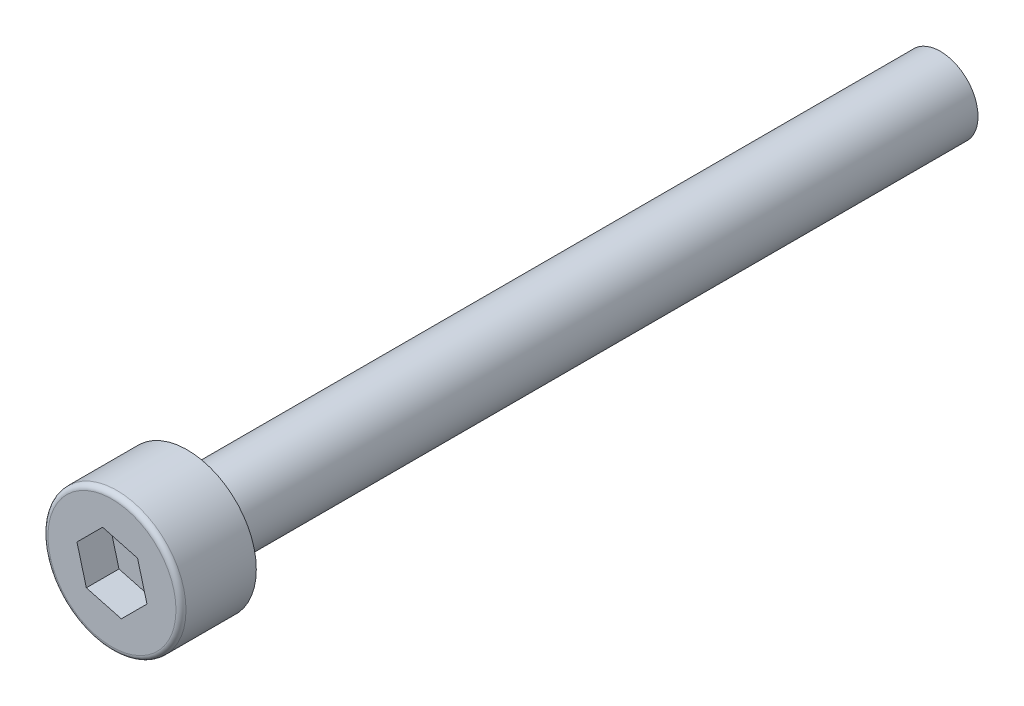
ISO-10303-21;
HEADER;
FILE_DESCRIPTION(('STEP AP214'),'2;1');
FILE_NAME('part.step','',(''),(''),'','','');
FILE_SCHEMA(('AUTOMOTIVE_DESIGN { 1 0 10303 214 1 1 1 1 }'));
ENDSEC;
DATA;
#1=APPLICATION_CONTEXT('core data for automotive mechanical design processes');
#2=APPLICATION_PROTOCOL_DEFINITION('international standard','automotive_design',2000,#1);
#3=PRODUCT_CONTEXT('',#1,'mechanical');
#4=PRODUCT('Part','Part','',(#3));
#5=PRODUCT_RELATED_PRODUCT_CATEGORY('part','',(#4));
#6=PRODUCT_DEFINITION_FORMATION('','',#4);
#7=PRODUCT_DEFINITION_CONTEXT('part definition',#1,'design');
#8=PRODUCT_DEFINITION('design','',#6,#7);
#9=PRODUCT_DEFINITION_SHAPE('','',#8);
#10=(LENGTH_UNIT() NAMED_UNIT(*) SI_UNIT(.MILLI.,.METRE.));
#11=(NAMED_UNIT(*) PLANE_ANGLE_UNIT() SI_UNIT($,.RADIAN.));
#12=(NAMED_UNIT(*) SI_UNIT($,.STERADIAN.) SOLID_ANGLE_UNIT());
#13=UNCERTAINTY_MEASURE_WITH_UNIT(LENGTH_MEASURE(1.E-05),#10,'distance_accuracy_value','');
#14=(GEOMETRIC_REPRESENTATION_CONTEXT(3) GLOBAL_UNCERTAINTY_ASSIGNED_CONTEXT((#13)) GLOBAL_UNIT_ASSIGNED_CONTEXT((#10,
#11,#12)) REPRESENTATION_CONTEXT('',''));
#15=CARTESIAN_POINT('',(0.,0.,0.));
#16=DIRECTION('',(0.,0.,1.));
#17=DIRECTION('',(1.,0.,0.));
#18=AXIS2_PLACEMENT_3D('',#15,#16,#17);
#19=CARTESIAN_POINT('',(0.,0.,0.));
#20=DIRECTION('',(0.,0.,1.));
#21=DIRECTION('',(1.,0.,0.));
#22=AXIS2_PLACEMENT_3D('',#19,#20,#21);
#23=PLANE('',#22);
#24=CARTESIAN_POINT('',(0.,0.,0.));
#25=DIRECTION('',(0.,0.,1.));
#26=DIRECTION('',(1.,0.,0.));
#27=AXIS2_PLACEMENT_3D('',#24,#25,#26);
#28=CIRCLE('',#27,2.75);
#29=CARTESIAN_POINT('',(2.75,0.,0.));
#30=VERTEX_POINT('',#29);
#31=EDGE_CURVE('E137',#30,#30,#28,.T.);
#32=ORIENTED_EDGE('',*,*,#31,.F.);
#33=EDGE_LOOP('',(#32));
#34=FACE_BOUND('',#33,.T.);
#35=CARTESIAN_POINT('',(0.,0.,0.));
#36=DIRECTION('',(0.,0.,1.));
#37=DIRECTION('',(1.,0.,0.));
#38=AXIS2_PLACEMENT_3D('',#35,#36,#37);
#39=CIRCLE('',#38,1.5);
#40=CARTESIAN_POINT('',(1.5,0.,0.));
#41=VERTEX_POINT('',#40);
#42=EDGE_CURVE('E145',#41,#41,#39,.F.);
#43=ORIENTED_EDGE('',*,*,#42,.F.);
#44=EDGE_LOOP('',(#43));
#45=FACE_BOUND('',#44,.T.);
#46=ADVANCED_FACE('F34',(#34,#45),#23,.F.);
#47=CARTESIAN_POINT('',(0.,0.,3.));
#48=DIRECTION('',(0.,0.,-1.));
#49=DIRECTION('',(-1.,0.,0.));
#50=AXIS2_PLACEMENT_3D('',#47,#48,#49);
#51=CYLINDRICAL_SURFACE('',#50,2.75);
#52=CARTESIAN_POINT('',(0.,0.,2.8));
#53=DIRECTION('',(0.,0.,1.));
#54=DIRECTION('',(1.,0.,0.));
#55=AXIS2_PLACEMENT_3D('',#52,#53,#54);
#56=CIRCLE('',#55,2.75);
#57=CARTESIAN_POINT('',(2.75,0.,2.8));
#58=VERTEX_POINT('',#57);
#59=EDGE_CURVE('E11',#58,#58,#56,.F.);
#60=ORIENTED_EDGE('',*,*,#59,.T.);
#61=EDGE_LOOP('',(#60));
#62=FACE_BOUND('',#61,.T.);
#63=ORIENTED_EDGE('',*,*,#31,.T.);
#64=EDGE_LOOP('',(#63));
#65=FACE_BOUND('',#64,.T.);
#66=ADVANCED_FACE('F164',(#62,#65),#51,.T.);
#67=CARTESIAN_POINT('',(0.,0.,3.));
#68=DIRECTION('',(0.,0.,1.));
#69=DIRECTION('',(1.,0.,0.));
#70=AXIS2_PLACEMENT_3D('',#67,#68,#69);
#71=PLANE('',#70);
#72=CARTESIAN_POINT('',(0.,0.,3.));
#73=DIRECTION('',(0.,0.,1.));
#74=DIRECTION('',(1.,0.,0.));
#75=AXIS2_PLACEMENT_3D('',#72,#73,#74);
#76=CIRCLE('',#75,2.55);
#77=CARTESIAN_POINT('',(2.55,0.,3.));
#78=VERTEX_POINT('',#77);
#79=EDGE_CURVE('E42',#78,#78,#76,.T.);
#80=ORIENTED_EDGE('',*,*,#79,.T.);
#81=EDGE_LOOP('',(#80));
#82=FACE_BOUND('',#81,.T.);
#83=DIRECTION('',(0.258819045102521,-0.965925826289068,0.));
#84=VECTOR('',#83,1.);
#85=CARTESIAN_POINT('',(-1.39419383956301,0.373573113403356,3.));
#86=LINE('',#85,#84);
#87=CARTESIAN_POINT('',(-1.39419383956301,0.373573113403356,3.));
#88=VERTEX_POINT('',#87);
#89=CARTESIAN_POINT('',(-1.02062072615966,-1.02062072615966,3.));
#90=VERTEX_POINT('',#89);
#91=EDGE_CURVE('E49',#88,#90,#86,.T.);
#92=ORIENTED_EDGE('',*,*,#91,.F.);
#93=DIRECTION('',(-0.707106781186548,-0.707106781186548,0.));
#94=VECTOR('',#93,1.);
#95=CARTESIAN_POINT('',(-0.373573113403355,1.39419383956301,3.));
#96=LINE('',#95,#94);
#97=CARTESIAN_POINT('',(-0.373573113403355,1.39419383956301,3.));
#98=VERTEX_POINT('',#97);
#99=EDGE_CURVE('E133',#98,#88,#96,.T.);
#100=ORIENTED_EDGE('',*,*,#99,.F.);
#101=DIRECTION('',(-0.965925826289068,0.258819045102521,0.));
#102=VECTOR('',#101,1.);
#103=CARTESIAN_POINT('',(1.02062072615966,1.02062072615966,3.));
#104=LINE('',#103,#102);
#105=CARTESIAN_POINT('',(1.02062072615966,1.02062072615966,3.));
#106=VERTEX_POINT('',#105);
#107=EDGE_CURVE('E131',#106,#98,#104,.T.);
#108=ORIENTED_EDGE('',*,*,#107,.F.);
#109=DIRECTION('',(-0.258819045102521,0.965925826289068,0.));
#110=VECTOR('',#109,1.);
#111=CARTESIAN_POINT('',(1.39419383956301,-0.373573113403355,3.));
#112=LINE('',#111,#110);
#113=CARTESIAN_POINT('',(1.39419383956301,-0.373573113403355,3.));
#114=VERTEX_POINT('',#113);
#115=EDGE_CURVE('E97',#114,#106,#112,.T.);
#116=ORIENTED_EDGE('',*,*,#115,.F.);
#117=DIRECTION('',(0.707106781186548,0.707106781186548,0.));
#118=VECTOR('',#117,1.);
#119=CARTESIAN_POINT('',(0.373573113403355,-1.39419383956301,3.));
#120=LINE('',#119,#118);
#121=CARTESIAN_POINT('',(0.373573113403355,-1.39419383956301,3.));
#122=VERTEX_POINT('',#121);
#123=EDGE_CURVE('E127',#122,#114,#120,.T.);
#124=ORIENTED_EDGE('',*,*,#123,.F.);
#125=DIRECTION('',(0.965925826289068,-0.258819045102521,0.));
#126=VECTOR('',#125,1.);
#127=CARTESIAN_POINT('',(-1.02062072615966,-1.02062072615966,3.));
#128=LINE('',#127,#126);
#129=EDGE_CURVE('E123',#90,#122,#128,.T.);
#130=ORIENTED_EDGE('',*,*,#129,.F.);
#131=EDGE_LOOP('',(#92,#100,#108,#116,#124,#130));
#132=FACE_BOUND('',#131,.T.);
#133=ADVANCED_FACE('F150',(#82,#132),#71,.T.);
#134=CARTESIAN_POINT('',(-1.39419383956301,0.373573113403356,1.7));
#135=DIRECTION('',(-0.965925826289068,-0.258819045102521,0.));
#136=DIRECTION('',(0.258819045102521,-0.965925826289068,0.));
#137=AXIS2_PLACEMENT_3D('',#134,#135,#136);
#138=PLANE('',#137);
#139=ORIENTED_EDGE('',*,*,#91,.T.);
#140=DIRECTION('',(0.,0.,1.));
#141=VECTOR('',#140,1.);
#142=CARTESIAN_POINT('',(-1.02062072615966,-1.02062072615966,1.7));
#143=LINE('',#142,#141);
#144=CARTESIAN_POINT('',(-1.02062072615966,-1.02062072615966,1.7));
#145=VERTEX_POINT('',#144);
#146=EDGE_CURVE('E79',#145,#90,#143,.T.);
#147=ORIENTED_EDGE('',*,*,#146,.F.);
#148=DIRECTION('',(0.258819045102521,-0.965925826289068,0.));
#149=VECTOR('',#148,1.);
#150=CARTESIAN_POINT('',(-1.39419383956301,0.373573113403356,1.7));
#151=LINE('',#150,#149);
#152=CARTESIAN_POINT('',(-1.39419383956301,0.373573113403356,1.7));
#153=VERTEX_POINT('',#152);
#154=EDGE_CURVE('E135',#153,#145,#151,.T.);
#155=ORIENTED_EDGE('',*,*,#154,.F.);
#156=DIRECTION('',(0.,0.,1.));
#157=VECTOR('',#156,1.);
#158=CARTESIAN_POINT('',(-1.39419383956301,0.373573113403356,1.7));
#159=LINE('',#158,#157);
#160=EDGE_CURVE('E57',#153,#88,#159,.T.);
#161=ORIENTED_EDGE('',*,*,#160,.T.);
#162=EDGE_LOOP('',(#139,#147,#155,#161));
#163=FACE_BOUND('',#162,.T.);
#164=ADVANCED_FACE('F176',(#163),#138,.F.);
#165=CARTESIAN_POINT('',(-0.373573113403355,1.39419383956301,1.7));
#166=DIRECTION('',(-0.707106781186548,0.707106781186548,0.));
#167=DIRECTION('',(-0.707106781186548,-0.707106781186548,0.));
#168=AXIS2_PLACEMENT_3D('',#165,#166,#167);
#169=PLANE('',#168);
#170=ORIENTED_EDGE('',*,*,#99,.T.);
#171=ORIENTED_EDGE('',*,*,#160,.F.);
#172=DIRECTION('',(-0.707106781186548,-0.707106781186548,0.));
#173=VECTOR('',#172,1.);
#174=CARTESIAN_POINT('',(-0.373573113403355,1.39419383956301,1.7));
#175=LINE('',#174,#173);
#176=CARTESIAN_POINT('',(-0.373573113403355,1.39419383956301,1.7));
#177=VERTEX_POINT('',#176);
#178=EDGE_CURVE('E109',#177,#153,#175,.T.);
#179=ORIENTED_EDGE('',*,*,#178,.F.);
#180=DIRECTION('',(0.,0.,1.));
#181=VECTOR('',#180,1.);
#182=CARTESIAN_POINT('',(-0.373573113403355,1.39419383956301,1.7));
#183=LINE('',#182,#181);
#184=EDGE_CURVE('E101',#177,#98,#183,.T.);
#185=ORIENTED_EDGE('',*,*,#184,.T.);
#186=EDGE_LOOP('',(#170,#171,#179,#185));
#187=FACE_BOUND('',#186,.T.);
#188=ADVANCED_FACE('F179',(#187),#169,.F.);
#189=CARTESIAN_POINT('',(1.02062072615966,1.02062072615966,1.7));
#190=DIRECTION('',(0.258819045102521,0.965925826289068,0.));
#191=DIRECTION('',(-0.965925826289068,0.258819045102521,0.));
#192=AXIS2_PLACEMENT_3D('',#189,#190,#191);
#193=PLANE('',#192);
#194=ORIENTED_EDGE('',*,*,#107,.T.);
#195=ORIENTED_EDGE('',*,*,#184,.F.);
#196=DIRECTION('',(-0.965925826289068,0.258819045102521,0.));
#197=VECTOR('',#196,1.);
#198=CARTESIAN_POINT('',(1.02062072615966,1.02062072615966,1.7));
#199=LINE('',#198,#197);
#200=CARTESIAN_POINT('',(1.02062072615966,1.02062072615966,1.7));
#201=VERTEX_POINT('',#200);
#202=EDGE_CURVE('E105',#201,#177,#199,.T.);
#203=ORIENTED_EDGE('',*,*,#202,.F.);
#204=DIRECTION('',(0.,0.,1.));
#205=VECTOR('',#204,1.);
#206=CARTESIAN_POINT('',(1.02062072615966,1.02062072615966,1.7));
#207=LINE('',#206,#205);
#208=EDGE_CURVE('E90',#201,#106,#207,.T.);
#209=ORIENTED_EDGE('',*,*,#208,.T.);
#210=EDGE_LOOP('',(#194,#195,#203,#209));
#211=FACE_BOUND('',#210,.T.);
#212=ADVANCED_FACE('F106',(#211),#193,.F.);
#213=CARTESIAN_POINT('',(1.39419383956301,-0.373573113403355,1.7));
#214=DIRECTION('',(0.965925826289068,0.258819045102521,0.));
#215=DIRECTION('',(-0.258819045102521,0.965925826289068,0.));
#216=AXIS2_PLACEMENT_3D('',#213,#214,#215);
#217=PLANE('',#216);
#218=ORIENTED_EDGE('',*,*,#115,.T.);
#219=ORIENTED_EDGE('',*,*,#208,.F.);
#220=DIRECTION('',(-0.258819045102521,0.965925826289068,0.));
#221=VECTOR('',#220,1.);
#222=CARTESIAN_POINT('',(1.39419383956301,-0.373573113403355,1.7));
#223=LINE('',#222,#221);
#224=CARTESIAN_POINT('',(1.39419383956301,-0.373573113403355,1.7));
#225=VERTEX_POINT('',#224);
#226=EDGE_CURVE('E94',#225,#201,#223,.T.);
#227=ORIENTED_EDGE('',*,*,#226,.F.);
#228=DIRECTION('',(0.,0.,1.));
#229=VECTOR('',#228,1.);
#230=CARTESIAN_POINT('',(1.39419383956301,-0.373573113403355,1.7));
#231=LINE('',#230,#229);
#232=EDGE_CURVE('E102',#225,#114,#231,.T.);
#233=ORIENTED_EDGE('',*,*,#232,.T.);
#234=EDGE_LOOP('',(#218,#219,#227,#233));
#235=FACE_BOUND('',#234,.T.);
#236=ADVANCED_FACE('F92',(#235),#217,.F.);
#237=CARTESIAN_POINT('',(0.373573113403355,-1.39419383956301,1.7));
#238=DIRECTION('',(0.707106781186548,-0.707106781186548,0.));
#239=DIRECTION('',(0.707106781186548,0.707106781186548,0.));
#240=AXIS2_PLACEMENT_3D('',#237,#238,#239);
#241=PLANE('',#240);
#242=ORIENTED_EDGE('',*,*,#123,.T.);
#243=ORIENTED_EDGE('',*,*,#232,.F.);
#244=DIRECTION('',(0.707106781186548,0.707106781186548,0.));
#245=VECTOR('',#244,1.);
#246=CARTESIAN_POINT('',(0.373573113403355,-1.39419383956301,1.7));
#247=LINE('',#246,#245);
#248=CARTESIAN_POINT('',(0.373573113403355,-1.39419383956301,1.7));
#249=VERTEX_POINT('',#248);
#250=EDGE_CURVE('E115',#249,#225,#247,.T.);
#251=ORIENTED_EDGE('',*,*,#250,.F.);
#252=DIRECTION('',(0.,0.,1.));
#253=VECTOR('',#252,1.);
#254=CARTESIAN_POINT('',(0.373573113403355,-1.39419383956301,1.7));
#255=LINE('',#254,#253);
#256=EDGE_CURVE('E140',#249,#122,#255,.T.);
#257=ORIENTED_EDGE('',*,*,#256,.T.);
#258=EDGE_LOOP('',(#242,#243,#251,#257));
#259=FACE_BOUND('',#258,.T.);
#260=ADVANCED_FACE('F183',(#259),#241,.F.);
#261=CARTESIAN_POINT('',(-1.02062072615966,-1.02062072615966,1.7));
#262=DIRECTION('',(-0.258819045102521,-0.965925826289068,0.));
#263=DIRECTION('',(0.965925826289068,-0.258819045102521,0.));
#264=AXIS2_PLACEMENT_3D('',#261,#262,#263);
#265=PLANE('',#264);
#266=ORIENTED_EDGE('',*,*,#129,.T.);
#267=ORIENTED_EDGE('',*,*,#256,.F.);
#268=DIRECTION('',(0.965925826289068,-0.258819045102521,0.));
#269=VECTOR('',#268,1.);
#270=CARTESIAN_POINT('',(-1.02062072615966,-1.02062072615966,1.7));
#271=LINE('',#270,#269);
#272=EDGE_CURVE('E117',#145,#249,#271,.T.);
#273=ORIENTED_EDGE('',*,*,#272,.F.);
#274=ORIENTED_EDGE('',*,*,#146,.T.);
#275=EDGE_LOOP('',(#266,#267,#273,#274));
#276=FACE_BOUND('',#275,.T.);
#277=ADVANCED_FACE('F180',(#276),#265,.F.);
#278=CARTESIAN_POINT('',(0.,0.,1.7));
#279=DIRECTION('',(0.,0.,1.));
#280=DIRECTION('',(1.,0.,0.));
#281=AXIS2_PLACEMENT_3D('',#278,#279,#280);
#282=PLANE('',#281);
#283=ORIENTED_EDGE('',*,*,#154,.T.);
#284=ORIENTED_EDGE('',*,*,#272,.T.);
#285=ORIENTED_EDGE('',*,*,#250,.T.);
#286=ORIENTED_EDGE('',*,*,#226,.T.);
#287=ORIENTED_EDGE('',*,*,#202,.T.);
#288=ORIENTED_EDGE('',*,*,#178,.T.);
#289=EDGE_LOOP('',(#283,#284,#285,#286,#287,#288));
#290=FACE_BOUND('',#289,.T.);
#291=ADVANCED_FACE('F112',(#290),#282,.T.);
#292=CARTESIAN_POINT('',(0.,0.,-30.));
#293=DIRECTION('',(0.,0.,1.));
#294=DIRECTION('',(1.,0.,0.));
#295=AXIS2_PLACEMENT_3D('',#292,#293,#294);
#296=CYLINDRICAL_SURFACE('',#295,1.5);
#297=CARTESIAN_POINT('',(0.,0.,-30.));
#298=DIRECTION('',(0.,0.,-1.));
#299=DIRECTION('',(-1.,0.,0.));
#300=AXIS2_PLACEMENT_3D('',#297,#298,#299);
#301=CIRCLE('',#300,1.5);
#302=CARTESIAN_POINT('',(-1.5,0.,-30.));
#303=VERTEX_POINT('',#302);
#304=EDGE_CURVE('E124',#303,#303,#301,.T.);
#305=ORIENTED_EDGE('',*,*,#304,.F.);
#306=EDGE_LOOP('',(#305));
#307=FACE_BOUND('',#306,.T.);
#308=ORIENTED_EDGE('',*,*,#42,.T.);
#309=EDGE_LOOP('',(#308));
#310=FACE_BOUND('',#309,.T.);
#311=ADVANCED_FACE('F159',(#307,#310),#296,.T.);
#312=CARTESIAN_POINT('',(0.,0.,-30.));
#313=DIRECTION('',(0.,0.,-1.));
#314=DIRECTION('',(-1.,0.,0.));
#315=AXIS2_PLACEMENT_3D('',#312,#313,#314);
#316=PLANE('',#315);
#317=ORIENTED_EDGE('',*,*,#304,.T.);
#318=EDGE_LOOP('',(#317));
#319=FACE_BOUND('',#318,.T.);
#320=ADVANCED_FACE('F154',(#319),#316,.T.);
#321=CARTESIAN_POINT('',(0.,0.,2.8));
#322=DIRECTION('',(0.,0.,1.));
#323=DIRECTION('',(1.,0.,0.));
#324=AXIS2_PLACEMENT_3D('',#321,#322,#323);
#325=TOROIDAL_SURFACE('',#324,2.55,0.2);
#326=ORIENTED_EDGE('',*,*,#59,.F.);
#327=EDGE_LOOP('',(#326));
#328=FACE_BOUND('',#327,.T.);
#329=ORIENTED_EDGE('',*,*,#79,.F.);
#330=EDGE_LOOP('',(#329));
#331=FACE_BOUND('',#330,.T.);
#332=ADVANCED_FACE('F36',(#328,#331),#325,.T.);
#333=CLOSED_SHELL('',(#46,#66,#133,#164,#188,#212,#236,#260,#277,#291,#311,#320,#332));
#334=MANIFOLD_SOLID_BREP('B2',#333);
#335=ADVANCED_BREP_SHAPE_REPRESENTATION('',(#18,#334),#14);
#336=SHAPE_DEFINITION_REPRESENTATION(#9,#335);
ENDSEC;
END-ISO-10303-21;
